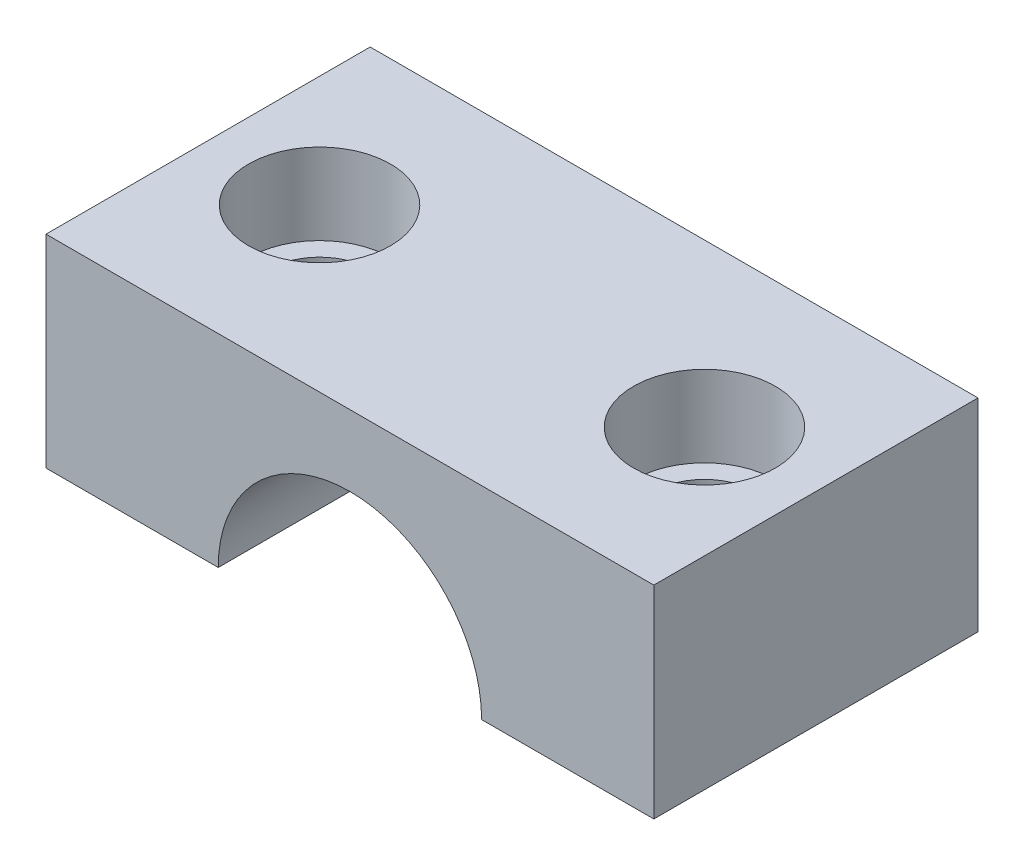
ISO-10303-21;
HEADER;
FILE_DESCRIPTION(('STEP AP214'),'2;1');
FILE_NAME('part.step','',(''),(''),'','','');
FILE_SCHEMA(('AUTOMOTIVE_DESIGN { 1 0 10303 214 1 1 1 1 }'));
ENDSEC;
DATA;
#1=APPLICATION_CONTEXT('core data for automotive mechanical design processes');
#2=APPLICATION_PROTOCOL_DEFINITION('international standard','automotive_design',2000,#1);
#3=PRODUCT_CONTEXT('',#1,'mechanical');
#4=PRODUCT('Part','Part','',(#3));
#5=PRODUCT_RELATED_PRODUCT_CATEGORY('part','',(#4));
#6=PRODUCT_DEFINITION_FORMATION('','',#4);
#7=PRODUCT_DEFINITION_CONTEXT('part definition',#1,'design');
#8=PRODUCT_DEFINITION('design','',#6,#7);
#9=PRODUCT_DEFINITION_SHAPE('','',#8);
#10=(LENGTH_UNIT() NAMED_UNIT(*) SI_UNIT(.MILLI.,.METRE.));
#11=(NAMED_UNIT(*) PLANE_ANGLE_UNIT() SI_UNIT($,.RADIAN.));
#12=(NAMED_UNIT(*) SI_UNIT($,.STERADIAN.) SOLID_ANGLE_UNIT());
#13=UNCERTAINTY_MEASURE_WITH_UNIT(LENGTH_MEASURE(1.E-05),#10,'distance_accuracy_value','');
#14=(GEOMETRIC_REPRESENTATION_CONTEXT(3) GLOBAL_UNCERTAINTY_ASSIGNED_CONTEXT((#13)) GLOBAL_UNIT_ASSIGNED_CONTEXT((#10,
#11,#12)) REPRESENTATION_CONTEXT('',''));
#15=CARTESIAN_POINT('',(0.,0.,0.));
#16=DIRECTION('',(0.,0.,1.));
#17=DIRECTION('',(1.,0.,0.));
#18=AXIS2_PLACEMENT_3D('',#15,#16,#17);
#19=CARTESIAN_POINT('',(0.,0.,32.));
#20=DIRECTION('',(0.,0.,-1.));
#21=DIRECTION('',(-1.,0.,0.));
#22=AXIS2_PLACEMENT_3D('',#19,#20,#21);
#23=CYLINDRICAL_SURFACE('',#22,13.);
#24=CARTESIAN_POINT('',(0.,0.,0.));
#25=DIRECTION('',(0.,0.,-1.));
#26=DIRECTION('',(-1.,0.,0.));
#27=AXIS2_PLACEMENT_3D('',#24,#25,#26);
#28=CIRCLE('',#27,13.);
#29=CARTESIAN_POINT('',(-13.,0.,0.));
#30=VERTEX_POINT('',#29);
#31=CARTESIAN_POINT('',(13.,0.,0.));
#32=VERTEX_POINT('',#31);
#33=EDGE_CURVE('E118',#30,#32,#28,.T.);
#34=ORIENTED_EDGE('',*,*,#33,.T.);
#35=DIRECTION('',(0.,0.,-1.));
#36=VECTOR('',#35,1.);
#37=CARTESIAN_POINT('',(13.,0.,32.));
#38=LINE('',#37,#36);
#39=CARTESIAN_POINT('',(13.,0.,32.));
#40=VERTEX_POINT('',#39);
#41=EDGE_CURVE('E11',#40,#32,#38,.T.);
#42=ORIENTED_EDGE('',*,*,#41,.F.);
#43=CARTESIAN_POINT('',(0.,0.,32.));
#44=DIRECTION('',(0.,0.,-1.));
#45=DIRECTION('',(-1.,0.,0.));
#46=AXIS2_PLACEMENT_3D('',#43,#44,#45);
#47=CIRCLE('',#46,13.);
#48=CARTESIAN_POINT('',(-13.,0.,32.));
#49=VERTEX_POINT('',#48);
#50=EDGE_CURVE('E129',#49,#40,#47,.T.);
#51=ORIENTED_EDGE('',*,*,#50,.F.);
#52=DIRECTION('',(0.,0.,-1.));
#53=VECTOR('',#52,1.);
#54=CARTESIAN_POINT('',(-13.,0.,32.));
#55=LINE('',#54,#53);
#56=EDGE_CURVE('E114',#49,#30,#55,.T.);
#57=ORIENTED_EDGE('',*,*,#56,.T.);
#58=EDGE_LOOP('',(#34,#42,#51,#57));
#59=FACE_BOUND('',#58,.T.);
#60=ADVANCED_FACE('F34',(#59),#23,.F.);
#61=CARTESIAN_POINT('',(13.,0.,32.));
#62=DIRECTION('',(0.,1.,0.));
#63=DIRECTION('',(-1.,0.,0.));
#64=AXIS2_PLACEMENT_3D('',#61,#62,#63);
#65=PLANE('',#64);
#66=CARTESIAN_POINT('',(19.,0.,16.));
#67=DIRECTION('',(0.,1.,0.));
#68=DIRECTION('',(0.,0.,1.));
#69=AXIS2_PLACEMENT_3D('',#66,#67,#68);
#70=CIRCLE('',#69,5.);
#71=CARTESIAN_POINT('',(19.,0.,21.));
#72=VERTEX_POINT('',#71);
#73=EDGE_CURVE('E122',#72,#72,#70,.T.);
#74=ORIENTED_EDGE('',*,*,#73,.T.);
#75=EDGE_LOOP('',(#74));
#76=FACE_BOUND('',#75,.T.);
#77=DIRECTION('',(1.,0.,0.));
#78=VECTOR('',#77,1.);
#79=CARTESIAN_POINT('',(13.,0.,0.));
#80=LINE('',#79,#78);
#81=CARTESIAN_POINT('',(30.,0.,0.));
#82=VERTEX_POINT('',#81);
#83=EDGE_CURVE('E121',#32,#82,#80,.T.);
#84=ORIENTED_EDGE('',*,*,#83,.T.);
#85=DIRECTION('',(0.,0.,-1.));
#86=VECTOR('',#85,1.);
#87=CARTESIAN_POINT('',(30.,0.,32.));
#88=LINE('',#87,#86);
#89=CARTESIAN_POINT('',(30.,0.,32.));
#90=VERTEX_POINT('',#89);
#91=EDGE_CURVE('E42',#90,#82,#88,.T.);
#92=ORIENTED_EDGE('',*,*,#91,.F.);
#93=DIRECTION('',(1.,0.,0.));
#94=VECTOR('',#93,1.);
#95=CARTESIAN_POINT('',(13.,0.,32.));
#96=LINE('',#95,#94);
#97=EDGE_CURVE('E87',#40,#90,#96,.T.);
#98=ORIENTED_EDGE('',*,*,#97,.F.);
#99=ORIENTED_EDGE('',*,*,#41,.T.);
#100=EDGE_LOOP('',(#84,#92,#98,#99));
#101=FACE_BOUND('',#100,.T.);
#102=ADVANCED_FACE('F155',(#76,#101),#65,.F.);
#103=CARTESIAN_POINT('',(30.,20.,32.));
#104=DIRECTION('',(-1.,0.,0.));
#105=DIRECTION('',(0.,0.,1.));
#106=AXIS2_PLACEMENT_3D('',#103,#104,#105);
#107=PLANE('',#106);
#108=DIRECTION('',(0.,1.,0.));
#109=VECTOR('',#108,1.);
#110=CARTESIAN_POINT('',(30.,20.,0.));
#111=LINE('',#110,#109);
#112=CARTESIAN_POINT('',(30.,20.,0.));
#113=VERTEX_POINT('',#112);
#114=EDGE_CURVE('E124',#82,#113,#111,.T.);
#115=ORIENTED_EDGE('',*,*,#114,.T.);
#116=DIRECTION('',(0.,0.,-1.));
#117=VECTOR('',#116,1.);
#118=CARTESIAN_POINT('',(30.,20.,32.));
#119=LINE('',#118,#117);
#120=CARTESIAN_POINT('',(30.,20.,32.));
#121=VERTEX_POINT('',#120);
#122=EDGE_CURVE('E109',#121,#113,#119,.T.);
#123=ORIENTED_EDGE('',*,*,#122,.F.);
#124=DIRECTION('',(0.,1.,0.));
#125=VECTOR('',#124,1.);
#126=CARTESIAN_POINT('',(30.,20.,32.));
#127=LINE('',#126,#125);
#128=EDGE_CURVE('E100',#90,#121,#127,.T.);
#129=ORIENTED_EDGE('',*,*,#128,.F.);
#130=ORIENTED_EDGE('',*,*,#91,.T.);
#131=EDGE_LOOP('',(#115,#123,#129,#130));
#132=FACE_BOUND('',#131,.T.);
#133=ADVANCED_FACE('F135',(#132),#107,.F.);
#134=CARTESIAN_POINT('',(-30.,20.,32.));
#135=DIRECTION('',(0.,-1.,0.));
#136=DIRECTION('',(0.,0.,-1.));
#137=AXIS2_PLACEMENT_3D('',#134,#135,#136);
#138=PLANE('',#137);
#139=CARTESIAN_POINT('',(-19.,20.,16.));
#140=DIRECTION('',(0.,1.,0.));
#141=DIRECTION('',(0.,0.,1.));
#142=AXIS2_PLACEMENT_3D('',#139,#140,#141);
#143=CIRCLE('',#142,7.);
#144=CARTESIAN_POINT('',(-19.,20.,23.));
#145=VERTEX_POINT('',#144);
#146=EDGE_CURVE('E173',#145,#145,#143,.T.);
#147=ORIENTED_EDGE('',*,*,#146,.F.);
#148=EDGE_LOOP('',(#147));
#149=FACE_BOUND('',#148,.T.);
#150=CARTESIAN_POINT('',(19.,20.,16.));
#151=DIRECTION('',(0.,1.,0.));
#152=DIRECTION('',(0.,0.,1.));
#153=AXIS2_PLACEMENT_3D('',#150,#151,#152);
#154=CIRCLE('',#153,7.);
#155=CARTESIAN_POINT('',(19.,20.,23.));
#156=VERTEX_POINT('',#155);
#157=EDGE_CURVE('E176',#156,#156,#154,.T.);
#158=ORIENTED_EDGE('',*,*,#157,.F.);
#159=EDGE_LOOP('',(#158));
#160=FACE_BOUND('',#159,.T.);
#161=DIRECTION('',(-1.,0.,0.));
#162=VECTOR('',#161,1.);
#163=CARTESIAN_POINT('',(-30.,20.,0.));
#164=LINE('',#163,#162);
#165=CARTESIAN_POINT('',(-30.,20.,0.));
#166=VERTEX_POINT('',#165);
#167=EDGE_CURVE('E108',#113,#166,#164,.T.);
#168=ORIENTED_EDGE('',*,*,#167,.T.);
#169=DIRECTION('',(0.,0.,-1.));
#170=VECTOR('',#169,1.);
#171=CARTESIAN_POINT('',(-30.,20.,32.));
#172=LINE('',#171,#170);
#173=CARTESIAN_POINT('',(-30.,20.,32.));
#174=VERTEX_POINT('',#173);
#175=EDGE_CURVE('E105',#174,#166,#172,.T.);
#176=ORIENTED_EDGE('',*,*,#175,.F.);
#177=DIRECTION('',(-1.,0.,0.));
#178=VECTOR('',#177,1.);
#179=CARTESIAN_POINT('',(-30.,20.,32.));
#180=LINE('',#179,#178);
#181=EDGE_CURVE('E94',#121,#174,#180,.T.);
#182=ORIENTED_EDGE('',*,*,#181,.F.);
#183=ORIENTED_EDGE('',*,*,#122,.T.);
#184=EDGE_LOOP('',(#168,#176,#182,#183));
#185=FACE_BOUND('',#184,.T.);
#186=ADVANCED_FACE('F106',(#149,#160,#185),#138,.F.);
#187=CARTESIAN_POINT('',(-30.,0.,32.));
#188=DIRECTION('',(1.,0.,0.));
#189=DIRECTION('',(0.,0.,-1.));
#190=AXIS2_PLACEMENT_3D('',#187,#188,#189);
#191=PLANE('',#190);
#192=DIRECTION('',(0.,-1.,0.));
#193=VECTOR('',#192,1.);
#194=CARTESIAN_POINT('',(-30.,0.,0.));
#195=LINE('',#194,#193);
#196=CARTESIAN_POINT('',(-30.,0.,0.));
#197=VERTEX_POINT('',#196);
#198=EDGE_CURVE('E73',#166,#197,#195,.T.);
#199=ORIENTED_EDGE('',*,*,#198,.T.);
#200=DIRECTION('',(0.,0.,-1.));
#201=VECTOR('',#200,1.);
#202=CARTESIAN_POINT('',(-30.,0.,32.));
#203=LINE('',#202,#201);
#204=CARTESIAN_POINT('',(-30.,0.,32.));
#205=VERTEX_POINT('',#204);
#206=EDGE_CURVE('E110',#205,#197,#203,.T.);
#207=ORIENTED_EDGE('',*,*,#206,.F.);
#208=DIRECTION('',(0.,-1.,0.));
#209=VECTOR('',#208,1.);
#210=CARTESIAN_POINT('',(-30.,0.,32.));
#211=LINE('',#210,#209);
#212=EDGE_CURVE('E98',#174,#205,#211,.T.);
#213=ORIENTED_EDGE('',*,*,#212,.F.);
#214=ORIENTED_EDGE('',*,*,#175,.T.);
#215=EDGE_LOOP('',(#199,#207,#213,#214));
#216=FACE_BOUND('',#215,.T.);
#217=ADVANCED_FACE('F112',(#216),#191,.F.);
#218=CARTESIAN_POINT('',(-13.,0.,32.));
#219=DIRECTION('',(0.,1.,0.));
#220=DIRECTION('',(-1.,0.,0.));
#221=AXIS2_PLACEMENT_3D('',#218,#219,#220);
#222=PLANE('',#221);
#223=CARTESIAN_POINT('',(-19.,0.,16.));
#224=DIRECTION('',(0.,1.,0.));
#225=DIRECTION('',(0.,0.,1.));
#226=AXIS2_PLACEMENT_3D('',#223,#224,#225);
#227=CIRCLE('',#226,5.);
#228=CARTESIAN_POINT('',(-19.,0.,21.));
#229=VERTEX_POINT('',#228);
#230=EDGE_CURVE('E179',#229,#229,#227,.T.);
#231=ORIENTED_EDGE('',*,*,#230,.T.);
#232=EDGE_LOOP('',(#231));
#233=FACE_BOUND('',#232,.T.);
#234=DIRECTION('',(1.,0.,0.));
#235=VECTOR('',#234,1.);
#236=CARTESIAN_POINT('',(-13.,0.,0.));
#237=LINE('',#236,#235);
#238=EDGE_CURVE('E79',#197,#30,#237,.T.);
#239=ORIENTED_EDGE('',*,*,#238,.T.);
#240=ORIENTED_EDGE('',*,*,#56,.F.);
#241=DIRECTION('',(1.,0.,0.));
#242=VECTOR('',#241,1.);
#243=CARTESIAN_POINT('',(-13.,0.,32.));
#244=LINE('',#243,#242);
#245=EDGE_CURVE('E50',#205,#49,#244,.T.);
#246=ORIENTED_EDGE('',*,*,#245,.F.);
#247=ORIENTED_EDGE('',*,*,#206,.T.);
#248=EDGE_LOOP('',(#239,#240,#246,#247));
#249=FACE_BOUND('',#248,.T.);
#250=ADVANCED_FACE('F142',(#233,#249),#222,.F.);
#251=CARTESIAN_POINT('',(0.,0.,32.));
#252=DIRECTION('',(0.,0.,-1.));
#253=DIRECTION('',(-1.,0.,0.));
#254=AXIS2_PLACEMENT_3D('',#251,#252,#253);
#255=PLANE('',#254);
#256=ORIENTED_EDGE('',*,*,#50,.T.);
#257=ORIENTED_EDGE('',*,*,#97,.T.);
#258=ORIENTED_EDGE('',*,*,#128,.T.);
#259=ORIENTED_EDGE('',*,*,#181,.T.);
#260=ORIENTED_EDGE('',*,*,#212,.T.);
#261=ORIENTED_EDGE('',*,*,#245,.T.);
#262=EDGE_LOOP('',(#256,#257,#258,#259,#260,#261));
#263=FACE_BOUND('',#262,.T.);
#264=ADVANCED_FACE('F96',(#263),#255,.F.);
#265=CARTESIAN_POINT('',(0.,0.,0.));
#266=DIRECTION('',(0.,0.,-1.));
#267=DIRECTION('',(-1.,0.,0.));
#268=AXIS2_PLACEMENT_3D('',#265,#266,#267);
#269=PLANE('',#268);
#270=ORIENTED_EDGE('',*,*,#33,.F.);
#271=ORIENTED_EDGE('',*,*,#238,.F.);
#272=ORIENTED_EDGE('',*,*,#198,.F.);
#273=ORIENTED_EDGE('',*,*,#167,.F.);
#274=ORIENTED_EDGE('',*,*,#114,.F.);
#275=ORIENTED_EDGE('',*,*,#83,.F.);
#276=EDGE_LOOP('',(#270,#271,#272,#273,#274,#275));
#277=FACE_BOUND('',#276,.T.);
#278=ADVANCED_FACE('F138',(#277),#269,.T.);
#279=CARTESIAN_POINT('',(19.,20.,16.));
#280=DIRECTION('',(0.,1.,0.));
#281=DIRECTION('',(0.,0.,1.));
#282=AXIS2_PLACEMENT_3D('',#279,#280,#281);
#283=CYLINDRICAL_SURFACE('',#282,5.);
#284=ORIENTED_EDGE('',*,*,#73,.F.);
#285=EDGE_LOOP('',(#284));
#286=FACE_BOUND('',#285,.T.);
#287=CARTESIAN_POINT('',(19.,12.,16.));
#288=DIRECTION('',(0.,1.,0.));
#289=DIRECTION('',(0.,0.,1.));
#290=AXIS2_PLACEMENT_3D('',#287,#288,#289);
#291=CIRCLE('',#290,5.);
#292=CARTESIAN_POINT('',(19.,12.,21.));
#293=VERTEX_POINT('',#292);
#294=EDGE_CURVE('E182',#293,#293,#291,.T.);
#295=ORIENTED_EDGE('',*,*,#294,.T.);
#296=EDGE_LOOP('',(#295));
#297=FACE_BOUND('',#296,.T.);
#298=ADVANCED_FACE('F194',(#286,#297),#283,.F.);
#299=CARTESIAN_POINT('',(24.,12.,16.));
#300=DIRECTION('',(0.,-1.,0.));
#301=DIRECTION('',(0.,0.,-1.));
#302=AXIS2_PLACEMENT_3D('',#299,#300,#301);
#303=PLANE('',#302);
#304=ORIENTED_EDGE('',*,*,#294,.F.);
#305=EDGE_LOOP('',(#304));
#306=FACE_BOUND('',#305,.T.);
#307=CARTESIAN_POINT('',(19.,12.,16.));
#308=DIRECTION('',(0.,1.,0.));
#309=DIRECTION('',(0.,0.,1.));
#310=AXIS2_PLACEMENT_3D('',#307,#308,#309);
#311=CIRCLE('',#310,7.);
#312=CARTESIAN_POINT('',(19.,12.,23.));
#313=VERTEX_POINT('',#312);
#314=EDGE_CURVE('E178',#313,#313,#311,.T.);
#315=ORIENTED_EDGE('',*,*,#314,.T.);
#316=EDGE_LOOP('',(#315));
#317=FACE_BOUND('',#316,.T.);
#318=ADVANCED_FACE('F197',(#306,#317),#303,.F.);
#319=CARTESIAN_POINT('',(19.,20.,16.));
#320=DIRECTION('',(0.,1.,0.));
#321=DIRECTION('',(0.,0.,1.));
#322=AXIS2_PLACEMENT_3D('',#319,#320,#321);
#323=CYLINDRICAL_SURFACE('',#322,7.);
#324=ORIENTED_EDGE('',*,*,#314,.F.);
#325=EDGE_LOOP('',(#324));
#326=FACE_BOUND('',#325,.T.);
#327=ORIENTED_EDGE('',*,*,#157,.T.);
#328=EDGE_LOOP('',(#327));
#329=FACE_BOUND('',#328,.T.);
#330=ADVANCED_FACE('F203',(#326,#329),#323,.F.);
#331=CARTESIAN_POINT('',(-19.,20.,16.));
#332=DIRECTION('',(0.,1.,0.));
#333=DIRECTION('',(0.,0.,1.));
#334=AXIS2_PLACEMENT_3D('',#331,#332,#333);
#335=CYLINDRICAL_SURFACE('',#334,5.);
#336=ORIENTED_EDGE('',*,*,#230,.F.);
#337=EDGE_LOOP('',(#336));
#338=FACE_BOUND('',#337,.T.);
#339=CARTESIAN_POINT('',(-19.,12.,16.));
#340=DIRECTION('',(0.,1.,0.));
#341=DIRECTION('',(0.,0.,1.));
#342=AXIS2_PLACEMENT_3D('',#339,#340,#341);
#343=CIRCLE('',#342,5.);
#344=CARTESIAN_POINT('',(-19.,12.,21.));
#345=VERTEX_POINT('',#344);
#346=EDGE_CURVE('E184',#345,#345,#343,.T.);
#347=ORIENTED_EDGE('',*,*,#346,.T.);
#348=EDGE_LOOP('',(#347));
#349=FACE_BOUND('',#348,.T.);
#350=ADVANCED_FACE('F208',(#338,#349),#335,.F.);
#351=CARTESIAN_POINT('',(-14.,12.,16.));
#352=DIRECTION('',(0.,-1.,0.));
#353=DIRECTION('',(0.,0.,-1.));
#354=AXIS2_PLACEMENT_3D('',#351,#352,#353);
#355=PLANE('',#354);
#356=ORIENTED_EDGE('',*,*,#346,.F.);
#357=EDGE_LOOP('',(#356));
#358=FACE_BOUND('',#357,.T.);
#359=CARTESIAN_POINT('',(-19.,12.,16.));
#360=DIRECTION('',(0.,1.,0.));
#361=DIRECTION('',(0.,0.,1.));
#362=AXIS2_PLACEMENT_3D('',#359,#360,#361);
#363=CIRCLE('',#362,7.);
#364=CARTESIAN_POINT('',(-19.,12.,23.));
#365=VERTEX_POINT('',#364);
#366=EDGE_CURVE('E265',#365,#365,#363,.T.);
#367=ORIENTED_EDGE('',*,*,#366,.T.);
#368=EDGE_LOOP('',(#367));
#369=FACE_BOUND('',#368,.T.);
#370=ADVANCED_FACE('F213',(#358,#369),#355,.F.);
#371=CARTESIAN_POINT('',(-19.,20.,16.));
#372=DIRECTION('',(0.,1.,0.));
#373=DIRECTION('',(0.,0.,1.));
#374=AXIS2_PLACEMENT_3D('',#371,#372,#373);
#375=CYLINDRICAL_SURFACE('',#374,7.);
#376=ORIENTED_EDGE('',*,*,#366,.F.);
#377=EDGE_LOOP('',(#376));
#378=FACE_BOUND('',#377,.T.);
#379=ORIENTED_EDGE('',*,*,#146,.T.);
#380=EDGE_LOOP('',(#379));
#381=FACE_BOUND('',#380,.T.);
#382=ADVANCED_FACE('F249',(#378,#381),#375,.F.);
#383=CLOSED_SHELL('',(#60,#102,#133,#186,#217,#250,#264,#278,#298,#318,#330,#350,#370,#382));
#384=MANIFOLD_SOLID_BREP('B2',#383);
#385=ADVANCED_BREP_SHAPE_REPRESENTATION('',(#18,#384),#14);
#386=SHAPE_DEFINITION_REPRESENTATION(#9,#385);
ENDSEC;
END-ISO-10303-21;
